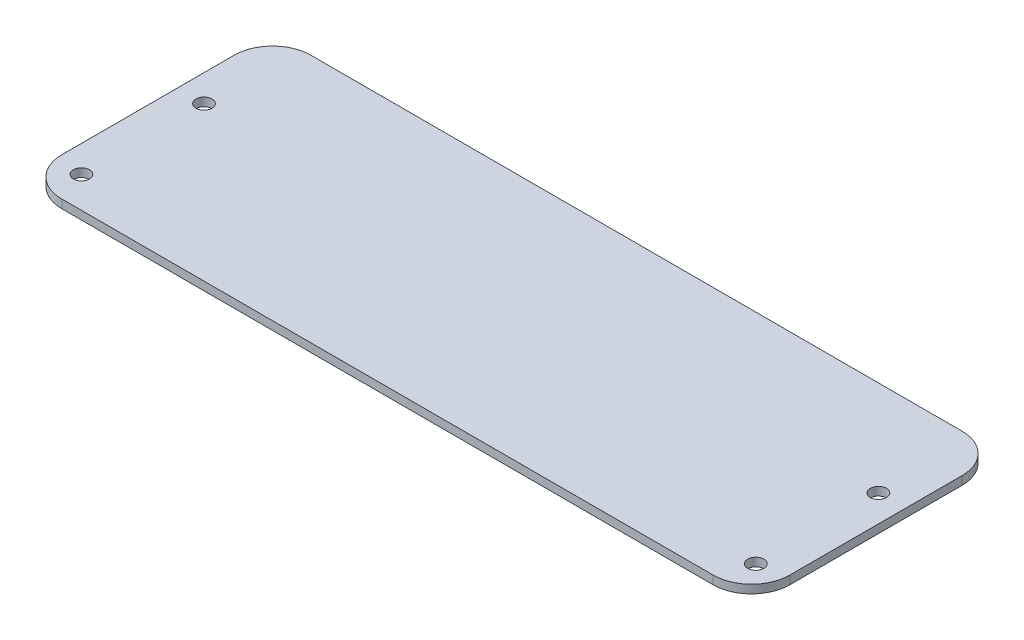
ISO-10303-21;
HEADER;
FILE_DESCRIPTION(('STEP AP214'),'2;1');
FILE_NAME('part.step','',(''),(''),'','','');
FILE_SCHEMA(('AUTOMOTIVE_DESIGN { 1 0 10303 214 1 1 1 1 }'));
ENDSEC;
DATA;
#1=APPLICATION_CONTEXT('core data for automotive mechanical design processes');
#2=APPLICATION_PROTOCOL_DEFINITION('international standard','automotive_design',2000,#1);
#3=PRODUCT_CONTEXT('',#1,'mechanical');
#4=PRODUCT('Part','Part','',(#3));
#5=PRODUCT_RELATED_PRODUCT_CATEGORY('part','',(#4));
#6=PRODUCT_DEFINITION_FORMATION('','',#4);
#7=PRODUCT_DEFINITION_CONTEXT('part definition',#1,'design');
#8=PRODUCT_DEFINITION('design','',#6,#7);
#9=PRODUCT_DEFINITION_SHAPE('','',#8);
#10=(LENGTH_UNIT() NAMED_UNIT(*) SI_UNIT(.MILLI.,.METRE.));
#11=(NAMED_UNIT(*) PLANE_ANGLE_UNIT() SI_UNIT($,.RADIAN.));
#12=(NAMED_UNIT(*) SI_UNIT($,.STERADIAN.) SOLID_ANGLE_UNIT());
#13=UNCERTAINTY_MEASURE_WITH_UNIT(LENGTH_MEASURE(1.E-05),#10,'distance_accuracy_value','');
#14=(GEOMETRIC_REPRESENTATION_CONTEXT(3) GLOBAL_UNCERTAINTY_ASSIGNED_CONTEXT((#13)) GLOBAL_UNIT_ASSIGNED_CONTEXT((#10,
#11,#12)) REPRESENTATION_CONTEXT('',''));
#15=CARTESIAN_POINT('',(0.,0.,0.));
#16=DIRECTION('',(0.,0.,1.));
#17=DIRECTION('',(1.,0.,0.));
#18=AXIS2_PLACEMENT_3D('',#15,#16,#17);
#19=CARTESIAN_POINT('',(0.,2.2,0.));
#20=DIRECTION('',(0.,-1.,0.));
#21=DIRECTION('',(0.,0.,-1.));
#22=AXIS2_PLACEMENT_3D('',#19,#20,#21);
#23=PLANE('',#22);
#24=DIRECTION('',(1.,0.,0.));
#25=VECTOR('',#24,1.);
#26=CARTESIAN_POINT('',(-95.,2.2,32.5));
#27=LINE('',#26,#25);
#28=CARTESIAN_POINT('',(-85.,2.2,32.5));
#29=VERTEX_POINT('',#28);
#30=CARTESIAN_POINT('',(85.,2.2,32.5));
#31=VERTEX_POINT('',#30);
#32=EDGE_CURVE('E140',#29,#31,#27,.T.);
#33=ORIENTED_EDGE('',*,*,#32,.T.);
#34=CARTESIAN_POINT('',(85.,2.2,22.5));
#35=DIRECTION('',(0.,-1.,0.));
#36=DIRECTION('',(0.,0.,-1.));
#37=AXIS2_PLACEMENT_3D('',#34,#35,#36);
#38=CIRCLE('',#37,10.);
#39=CARTESIAN_POINT('',(95.,2.2,22.5));
#40=VERTEX_POINT('',#39);
#41=EDGE_CURVE('E158',#31,#40,#38,.F.);
#42=ORIENTED_EDGE('',*,*,#41,.T.);
#43=DIRECTION('',(0.,0.,-1.));
#44=VECTOR('',#43,1.);
#45=CARTESIAN_POINT('',(95.,2.2,32.5));
#46=LINE('',#45,#44);
#47=CARTESIAN_POINT('',(95.,2.2,-22.5));
#48=VERTEX_POINT('',#47);
#49=EDGE_CURVE('E122',#40,#48,#46,.T.);
#50=ORIENTED_EDGE('',*,*,#49,.T.);
#51=CARTESIAN_POINT('',(85.,2.2,-22.5));
#52=DIRECTION('',(0.,-1.,0.));
#53=DIRECTION('',(0.,0.,-1.));
#54=AXIS2_PLACEMENT_3D('',#51,#52,#53);
#55=CIRCLE('',#54,10.);
#56=CARTESIAN_POINT('',(85.,2.2,-32.5));
#57=VERTEX_POINT('',#56);
#58=EDGE_CURVE('E154',#48,#57,#55,.F.);
#59=ORIENTED_EDGE('',*,*,#58,.T.);
#60=DIRECTION('',(-1.,0.,0.));
#61=VECTOR('',#60,1.);
#62=CARTESIAN_POINT('',(-95.,2.2,-32.5));
#63=LINE('',#62,#61);
#64=CARTESIAN_POINT('',(-85.,2.2,-32.5));
#65=VERTEX_POINT('',#64);
#66=EDGE_CURVE('E167',#57,#65,#63,.T.);
#67=ORIENTED_EDGE('',*,*,#66,.T.);
#68=CARTESIAN_POINT('',(-85.,2.2,-22.5));
#69=DIRECTION('',(0.,-1.,0.));
#70=DIRECTION('',(0.,0.,-1.));
#71=AXIS2_PLACEMENT_3D('',#68,#69,#70);
#72=CIRCLE('',#71,10.);
#73=CARTESIAN_POINT('',(-95.,2.2,-22.5));
#74=VERTEX_POINT('',#73);
#75=EDGE_CURVE('E57',#65,#74,#72,.F.);
#76=ORIENTED_EDGE('',*,*,#75,.T.);
#77=DIRECTION('',(0.,0.,1.));
#78=VECTOR('',#77,1.);
#79=CARTESIAN_POINT('',(-95.,2.2,32.5));
#80=LINE('',#79,#78);
#81=CARTESIAN_POINT('',(-95.,2.2,22.5));
#82=VERTEX_POINT('',#81);
#83=EDGE_CURVE('E173',#74,#82,#80,.T.);
#84=ORIENTED_EDGE('',*,*,#83,.T.);
#85=CARTESIAN_POINT('',(-85.,2.2,22.5));
#86=DIRECTION('',(0.,-1.,0.));
#87=DIRECTION('',(0.,0.,-1.));
#88=AXIS2_PLACEMENT_3D('',#85,#86,#87);
#89=CIRCLE('',#88,10.);
#90=EDGE_CURVE('E156',#82,#29,#89,.F.);
#91=ORIENTED_EDGE('',*,*,#90,.T.);
#92=EDGE_LOOP('',(#33,#42,#50,#59,#67,#76,#84,#91));
#93=FACE_BOUND('',#92,.T.);
#94=CARTESIAN_POINT('',(-88.,2.2,-7.62317970732374));
#95=DIRECTION('',(0.,1.,0.));
#96=DIRECTION('',(0.,0.,1.));
#97=AXIS2_PLACEMENT_3D('',#94,#95,#96);
#98=CIRCLE('',#97,2.1);
#99=CARTESIAN_POINT('',(-88.,2.2,-5.52317970732373));
#100=VERTEX_POINT('',#99);
#101=EDGE_CURVE('E131',#100,#100,#98,.T.);
#102=ORIENTED_EDGE('',*,*,#101,.F.);
#103=EDGE_LOOP('',(#102));
#104=FACE_BOUND('',#103,.T.);
#105=CARTESIAN_POINT('',(-88.,2.2,24.3768202926763));
#106=DIRECTION('',(0.,1.,0.));
#107=DIRECTION('',(0.,0.,1.));
#108=AXIS2_PLACEMENT_3D('',#105,#106,#107);
#109=CIRCLE('',#108,2.1);
#110=CARTESIAN_POINT('',(-88.,2.2,26.4768202926763));
#111=VERTEX_POINT('',#110);
#112=EDGE_CURVE('E188',#111,#111,#109,.T.);
#113=ORIENTED_EDGE('',*,*,#112,.F.);
#114=EDGE_LOOP('',(#113));
#115=FACE_BOUND('',#114,.T.);
#116=CARTESIAN_POINT('',(88.,2.2,24.3768202926763));
#117=DIRECTION('',(0.,1.,0.));
#118=DIRECTION('',(0.,0.,-1.));
#119=AXIS2_PLACEMENT_3D('',#116,#117,#118);
#120=CIRCLE('',#119,2.1);
#121=CARTESIAN_POINT('',(88.,2.2,22.2768202926763));
#122=VERTEX_POINT('',#121);
#123=EDGE_CURVE('E193',#122,#122,#120,.T.);
#124=ORIENTED_EDGE('',*,*,#123,.F.);
#125=EDGE_LOOP('',(#124));
#126=FACE_BOUND('',#125,.T.);
#127=CARTESIAN_POINT('',(88.,2.2,-7.62317970732374));
#128=DIRECTION('',(0.,1.,0.));
#129=DIRECTION('',(0.,0.,-1.));
#130=AXIS2_PLACEMENT_3D('',#127,#128,#129);
#131=CIRCLE('',#130,2.1);
#132=CARTESIAN_POINT('',(88.,2.2,-9.72317970732374));
#133=VERTEX_POINT('',#132);
#134=EDGE_CURVE('E199',#133,#133,#131,.T.);
#135=ORIENTED_EDGE('',*,*,#134,.F.);
#136=EDGE_LOOP('',(#135));
#137=FACE_BOUND('',#136,.T.);
#138=ADVANCED_FACE('F35',(#93,#104,#115,#126,#137),#23,.F.);
#139=CARTESIAN_POINT('',(0.,0.,0.));
#140=DIRECTION('',(0.,-1.,0.));
#141=DIRECTION('',(0.,0.,-1.));
#142=AXIS2_PLACEMENT_3D('',#139,#140,#141);
#143=PLANE('',#142);
#144=CARTESIAN_POINT('',(88.,0.,24.3768202926763));
#145=DIRECTION('',(0.,1.,0.));
#146=DIRECTION('',(0.,0.,-1.));
#147=AXIS2_PLACEMENT_3D('',#144,#145,#146);
#148=CIRCLE('',#147,2.1);
#149=CARTESIAN_POINT('',(88.,0.,22.2768202926763));
#150=VERTEX_POINT('',#149);
#151=EDGE_CURVE('E196',#150,#150,#148,.T.);
#152=ORIENTED_EDGE('',*,*,#151,.T.);
#153=EDGE_LOOP('',(#152));
#154=FACE_BOUND('',#153,.T.);
#155=CARTESIAN_POINT('',(-88.,0.,-7.62317970732374));
#156=DIRECTION('',(0.,1.,0.));
#157=DIRECTION('',(0.,0.,1.));
#158=AXIS2_PLACEMENT_3D('',#155,#156,#157);
#159=CIRCLE('',#158,2.1);
#160=CARTESIAN_POINT('',(-88.,0.,-5.52317970732373));
#161=VERTEX_POINT('',#160);
#162=EDGE_CURVE('E137',#161,#161,#159,.T.);
#163=ORIENTED_EDGE('',*,*,#162,.T.);
#164=EDGE_LOOP('',(#163));
#165=FACE_BOUND('',#164,.T.);
#166=DIRECTION('',(0.,0.,-1.));
#167=VECTOR('',#166,1.);
#168=CARTESIAN_POINT('',(95.,0.,32.5));
#169=LINE('',#168,#167);
#170=CARTESIAN_POINT('',(95.,0.,22.5));
#171=VERTEX_POINT('',#170);
#172=CARTESIAN_POINT('',(95.,0.,-22.5));
#173=VERTEX_POINT('',#172);
#174=EDGE_CURVE('E119',#171,#173,#169,.T.);
#175=ORIENTED_EDGE('',*,*,#174,.F.);
#176=CARTESIAN_POINT('',(85.,0.,22.5));
#177=DIRECTION('',(0.,-1.,0.));
#178=DIRECTION('',(0.,0.,-1.));
#179=AXIS2_PLACEMENT_3D('',#176,#177,#178);
#180=CIRCLE('',#179,10.);
#181=CARTESIAN_POINT('',(85.,0.,32.5));
#182=VERTEX_POINT('',#181);
#183=EDGE_CURVE('E102',#171,#182,#180,.T.);
#184=ORIENTED_EDGE('',*,*,#183,.T.);
#185=DIRECTION('',(1.,0.,0.));
#186=VECTOR('',#185,1.);
#187=CARTESIAN_POINT('',(-95.,0.,32.5));
#188=LINE('',#187,#186);
#189=CARTESIAN_POINT('',(-85.,0.,32.5));
#190=VERTEX_POINT('',#189);
#191=EDGE_CURVE('E144',#190,#182,#188,.T.);
#192=ORIENTED_EDGE('',*,*,#191,.F.);
#193=CARTESIAN_POINT('',(-85.,0.,22.5));
#194=DIRECTION('',(0.,-1.,0.));
#195=DIRECTION('',(0.,0.,-1.));
#196=AXIS2_PLACEMENT_3D('',#193,#194,#195);
#197=CIRCLE('',#196,10.);
#198=CARTESIAN_POINT('',(-95.,0.,22.5));
#199=VERTEX_POINT('',#198);
#200=EDGE_CURVE('E113',#190,#199,#197,.T.);
#201=ORIENTED_EDGE('',*,*,#200,.T.);
#202=DIRECTION('',(0.,0.,1.));
#203=VECTOR('',#202,1.);
#204=CARTESIAN_POINT('',(-95.,0.,32.5));
#205=LINE('',#204,#203);
#206=CARTESIAN_POINT('',(-95.,0.,-22.5));
#207=VERTEX_POINT('',#206);
#208=EDGE_CURVE('E134',#207,#199,#205,.T.);
#209=ORIENTED_EDGE('',*,*,#208,.F.);
#210=CARTESIAN_POINT('',(-85.,0.,-22.5));
#211=DIRECTION('',(0.,-1.,0.));
#212=DIRECTION('',(0.,0.,-1.));
#213=AXIS2_PLACEMENT_3D('',#210,#211,#212);
#214=CIRCLE('',#213,10.);
#215=CARTESIAN_POINT('',(-85.,0.,-32.5));
#216=VERTEX_POINT('',#215);
#217=EDGE_CURVE('E123',#207,#216,#214,.T.);
#218=ORIENTED_EDGE('',*,*,#217,.T.);
#219=DIRECTION('',(-1.,0.,0.));
#220=VECTOR('',#219,1.);
#221=CARTESIAN_POINT('',(-95.,0.,-32.5));
#222=LINE('',#221,#220);
#223=CARTESIAN_POINT('',(85.,0.,-32.5));
#224=VERTEX_POINT('',#223);
#225=EDGE_CURVE('E130',#224,#216,#222,.T.);
#226=ORIENTED_EDGE('',*,*,#225,.F.);
#227=CARTESIAN_POINT('',(85.,0.,-22.5));
#228=DIRECTION('',(0.,-1.,0.));
#229=DIRECTION('',(0.,0.,-1.));
#230=AXIS2_PLACEMENT_3D('',#227,#228,#229);
#231=CIRCLE('',#230,10.);
#232=EDGE_CURVE('E129',#224,#173,#231,.T.);
#233=ORIENTED_EDGE('',*,*,#232,.T.);
#234=EDGE_LOOP('',(#175,#184,#192,#201,#209,#218,#226,#233));
#235=FACE_BOUND('',#234,.T.);
#236=CARTESIAN_POINT('',(-88.,0.,24.3768202926763));
#237=DIRECTION('',(0.,1.,0.));
#238=DIRECTION('',(0.,0.,1.));
#239=AXIS2_PLACEMENT_3D('',#236,#237,#238);
#240=CIRCLE('',#239,2.1);
#241=CARTESIAN_POINT('',(-88.,0.,26.4768202926763));
#242=VERTEX_POINT('',#241);
#243=EDGE_CURVE('E190',#242,#242,#240,.T.);
#244=ORIENTED_EDGE('',*,*,#243,.T.);
#245=EDGE_LOOP('',(#244));
#246=FACE_BOUND('',#245,.T.);
#247=CARTESIAN_POINT('',(88.,0.,-7.62317970732374));
#248=DIRECTION('',(0.,1.,0.));
#249=DIRECTION('',(0.,0.,-1.));
#250=AXIS2_PLACEMENT_3D('',#247,#248,#249);
#251=CIRCLE('',#250,2.1);
#252=CARTESIAN_POINT('',(88.,0.,-9.72317970732374));
#253=VERTEX_POINT('',#252);
#254=EDGE_CURVE('E202',#253,#253,#251,.T.);
#255=ORIENTED_EDGE('',*,*,#254,.T.);
#256=EDGE_LOOP('',(#255));
#257=FACE_BOUND('',#256,.T.);
#258=ADVANCED_FACE('F126',(#154,#165,#235,#246,#257),#143,.T.);
#259=CARTESIAN_POINT('',(95.,2.2,32.5));
#260=DIRECTION('',(-1.,0.,0.));
#261=DIRECTION('',(0.,0.,1.));
#262=AXIS2_PLACEMENT_3D('',#259,#260,#261);
#263=PLANE('',#262);
#264=ORIENTED_EDGE('',*,*,#49,.F.);
#265=DIRECTION('',(0.,-1.,0.));
#266=VECTOR('',#265,1.);
#267=CARTESIAN_POINT('',(95.,2.2,22.5));
#268=LINE('',#267,#266);
#269=EDGE_CURVE('E106',#40,#171,#268,.T.);
#270=ORIENTED_EDGE('',*,*,#269,.T.);
#271=ORIENTED_EDGE('',*,*,#174,.T.);
#272=DIRECTION('',(0.,-1.,0.));
#273=VECTOR('',#272,1.);
#274=CARTESIAN_POINT('',(95.,2.2,-22.5));
#275=LINE('',#274,#273);
#276=EDGE_CURVE('E124',#173,#48,#275,.F.);
#277=ORIENTED_EDGE('',*,*,#276,.T.);
#278=EDGE_LOOP('',(#264,#270,#271,#277));
#279=FACE_BOUND('',#278,.T.);
#280=ADVANCED_FACE('F118',(#279),#263,.F.);
#281=CARTESIAN_POINT('',(-95.,2.2,-32.5));
#282=DIRECTION('',(0.,0.,1.));
#283=DIRECTION('',(1.,0.,0.));
#284=AXIS2_PLACEMENT_3D('',#281,#282,#283);
#285=PLANE('',#284);
#286=ORIENTED_EDGE('',*,*,#66,.F.);
#287=DIRECTION('',(0.,-1.,0.));
#288=VECTOR('',#287,1.);
#289=CARTESIAN_POINT('',(85.,2.2,-32.5));
#290=LINE('',#289,#288);
#291=EDGE_CURVE('E11',#57,#224,#290,.T.);
#292=ORIENTED_EDGE('',*,*,#291,.T.);
#293=ORIENTED_EDGE('',*,*,#225,.T.);
#294=DIRECTION('',(0.,-1.,0.));
#295=VECTOR('',#294,1.);
#296=CARTESIAN_POINT('',(-85.,2.2,-32.5));
#297=LINE('',#296,#295);
#298=EDGE_CURVE('E43',#216,#65,#297,.F.);
#299=ORIENTED_EDGE('',*,*,#298,.T.);
#300=EDGE_LOOP('',(#286,#292,#293,#299));
#301=FACE_BOUND('',#300,.T.);
#302=ADVANCED_FACE('F166',(#301),#285,.F.);
#303=CARTESIAN_POINT('',(-95.,2.2,32.5));
#304=DIRECTION('',(1.,0.,0.));
#305=DIRECTION('',(0.,0.,-1.));
#306=AXIS2_PLACEMENT_3D('',#303,#304,#305);
#307=PLANE('',#306);
#308=ORIENTED_EDGE('',*,*,#208,.T.);
#309=DIRECTION('',(0.,-1.,0.));
#310=VECTOR('',#309,1.);
#311=CARTESIAN_POINT('',(-95.,2.2,22.5));
#312=LINE('',#311,#310);
#313=EDGE_CURVE('E50',#199,#82,#312,.F.);
#314=ORIENTED_EDGE('',*,*,#313,.T.);
#315=ORIENTED_EDGE('',*,*,#83,.F.);
#316=DIRECTION('',(0.,-1.,0.));
#317=VECTOR('',#316,1.);
#318=CARTESIAN_POINT('',(-95.,2.2,-22.5));
#319=LINE('',#318,#317);
#320=EDGE_CURVE('E160',#74,#207,#319,.T.);
#321=ORIENTED_EDGE('',*,*,#320,.T.);
#322=EDGE_LOOP('',(#308,#314,#315,#321));
#323=FACE_BOUND('',#322,.T.);
#324=ADVANCED_FACE('F177',(#323),#307,.F.);
#325=CARTESIAN_POINT('',(-95.,2.2,32.5));
#326=DIRECTION('',(0.,0.,-1.));
#327=DIRECTION('',(-1.,0.,0.));
#328=AXIS2_PLACEMENT_3D('',#325,#326,#327);
#329=PLANE('',#328);
#330=ORIENTED_EDGE('',*,*,#191,.T.);
#331=DIRECTION('',(0.,-1.,0.));
#332=VECTOR('',#331,1.);
#333=CARTESIAN_POINT('',(85.,2.2,32.5));
#334=LINE('',#333,#332);
#335=EDGE_CURVE('E107',#182,#31,#334,.F.);
#336=ORIENTED_EDGE('',*,*,#335,.T.);
#337=ORIENTED_EDGE('',*,*,#32,.F.);
#338=DIRECTION('',(0.,-1.,0.));
#339=VECTOR('',#338,1.);
#340=CARTESIAN_POINT('',(-85.,2.2,32.5));
#341=LINE('',#340,#339);
#342=EDGE_CURVE('E112',#29,#190,#341,.T.);
#343=ORIENTED_EDGE('',*,*,#342,.T.);
#344=EDGE_LOOP('',(#330,#336,#337,#343));
#345=FACE_BOUND('',#344,.T.);
#346=ADVANCED_FACE('F184',(#345),#329,.F.);
#347=CARTESIAN_POINT('',(-88.,2.2,-7.62317970732374));
#348=DIRECTION('',(0.,-1.,0.));
#349=DIRECTION('',(0.,0.,-1.));
#350=AXIS2_PLACEMENT_3D('',#347,#348,#349);
#351=CYLINDRICAL_SURFACE('',#350,2.1);
#352=ORIENTED_EDGE('',*,*,#101,.T.);
#353=EDGE_LOOP('',(#352));
#354=FACE_BOUND('',#353,.T.);
#355=ORIENTED_EDGE('',*,*,#162,.F.);
#356=EDGE_LOOP('',(#355));
#357=FACE_BOUND('',#356,.T.);
#358=ADVANCED_FACE('F219',(#354,#357),#351,.F.);
#359=CARTESIAN_POINT('',(-88.,2.2,24.3768202926763));
#360=DIRECTION('',(0.,-1.,0.));
#361=DIRECTION('',(0.,0.,-1.));
#362=AXIS2_PLACEMENT_3D('',#359,#360,#361);
#363=CYLINDRICAL_SURFACE('',#362,2.1);
#364=ORIENTED_EDGE('',*,*,#112,.T.);
#365=EDGE_LOOP('',(#364));
#366=FACE_BOUND('',#365,.T.);
#367=ORIENTED_EDGE('',*,*,#243,.F.);
#368=EDGE_LOOP('',(#367));
#369=FACE_BOUND('',#368,.T.);
#370=ADVANCED_FACE('F311',(#366,#369),#363,.F.);
#371=CARTESIAN_POINT('',(88.,2.2,24.3768202926763));
#372=DIRECTION('',(0.,-1.,0.));
#373=DIRECTION('',(0.,0.,-1.));
#374=AXIS2_PLACEMENT_3D('',#371,#372,#373);
#375=CYLINDRICAL_SURFACE('',#374,2.1);
#376=ORIENTED_EDGE('',*,*,#123,.T.);
#377=EDGE_LOOP('',(#376));
#378=FACE_BOUND('',#377,.T.);
#379=ORIENTED_EDGE('',*,*,#151,.F.);
#380=EDGE_LOOP('',(#379));
#381=FACE_BOUND('',#380,.T.);
#382=ADVANCED_FACE('F302',(#378,#381),#375,.F.);
#383=CARTESIAN_POINT('',(88.,2.2,-7.62317970732374));
#384=DIRECTION('',(0.,-1.,0.));
#385=DIRECTION('',(0.,0.,-1.));
#386=AXIS2_PLACEMENT_3D('',#383,#384,#385);
#387=CYLINDRICAL_SURFACE('',#386,2.1);
#388=ORIENTED_EDGE('',*,*,#134,.T.);
#389=EDGE_LOOP('',(#388));
#390=FACE_BOUND('',#389,.T.);
#391=ORIENTED_EDGE('',*,*,#254,.F.);
#392=EDGE_LOOP('',(#391));
#393=FACE_BOUND('',#392,.T.);
#394=ADVANCED_FACE('F208',(#390,#393),#387,.F.);
#395=CARTESIAN_POINT('',(85.,2.2,22.5));
#396=DIRECTION('',(0.,-1.,0.));
#397=DIRECTION('',(0.,0.,-1.));
#398=AXIS2_PLACEMENT_3D('',#395,#396,#397);
#399=CYLINDRICAL_SURFACE('',#398,10.);
#400=ORIENTED_EDGE('',*,*,#41,.F.);
#401=ORIENTED_EDGE('',*,*,#335,.F.);
#402=ORIENTED_EDGE('',*,*,#183,.F.);
#403=ORIENTED_EDGE('',*,*,#269,.F.);
#404=EDGE_LOOP('',(#400,#401,#402,#403));
#405=FACE_BOUND('',#404,.T.);
#406=ADVANCED_FACE('F105',(#405),#399,.T.);
#407=CARTESIAN_POINT('',(-85.,2.2,22.5));
#408=DIRECTION('',(0.,-1.,0.));
#409=DIRECTION('',(0.,0.,-1.));
#410=AXIS2_PLACEMENT_3D('',#407,#408,#409);
#411=CYLINDRICAL_SURFACE('',#410,10.);
#412=ORIENTED_EDGE('',*,*,#90,.F.);
#413=ORIENTED_EDGE('',*,*,#313,.F.);
#414=ORIENTED_EDGE('',*,*,#200,.F.);
#415=ORIENTED_EDGE('',*,*,#342,.F.);
#416=EDGE_LOOP('',(#412,#413,#414,#415));
#417=FACE_BOUND('',#416,.T.);
#418=ADVANCED_FACE('F181',(#417),#411,.T.);
#419=CARTESIAN_POINT('',(85.,2.2,-22.5));
#420=DIRECTION('',(0.,-1.,0.));
#421=DIRECTION('',(0.,0.,-1.));
#422=AXIS2_PLACEMENT_3D('',#419,#420,#421);
#423=CYLINDRICAL_SURFACE('',#422,10.);
#424=ORIENTED_EDGE('',*,*,#58,.F.);
#425=ORIENTED_EDGE('',*,*,#276,.F.);
#426=ORIENTED_EDGE('',*,*,#232,.F.);
#427=ORIENTED_EDGE('',*,*,#291,.F.);
#428=EDGE_LOOP('',(#424,#425,#426,#427));
#429=FACE_BOUND('',#428,.T.);
#430=ADVANCED_FACE('F233',(#429),#423,.T.);
#431=CARTESIAN_POINT('',(-85.,2.2,-22.5));
#432=DIRECTION('',(0.,-1.,0.));
#433=DIRECTION('',(0.,0.,-1.));
#434=AXIS2_PLACEMENT_3D('',#431,#432,#433);
#435=CYLINDRICAL_SURFACE('',#434,10.);
#436=ORIENTED_EDGE('',*,*,#75,.F.);
#437=ORIENTED_EDGE('',*,*,#298,.F.);
#438=ORIENTED_EDGE('',*,*,#217,.F.);
#439=ORIENTED_EDGE('',*,*,#320,.F.);
#440=EDGE_LOOP('',(#436,#437,#438,#439));
#441=FACE_BOUND('',#440,.T.);
#442=ADVANCED_FACE('F37',(#441),#435,.T.);
#443=CLOSED_SHELL('',(#138,#258,#280,#302,#324,#346,#358,#370,#382,#394,#406,#418,#430,#442));
#444=MANIFOLD_SOLID_BREP('B2',#443);
#445=ADVANCED_BREP_SHAPE_REPRESENTATION('',(#18,#444),#14);
#446=SHAPE_DEFINITION_REPRESENTATION(#9,#445);
ENDSEC;
END-ISO-10303-21;
